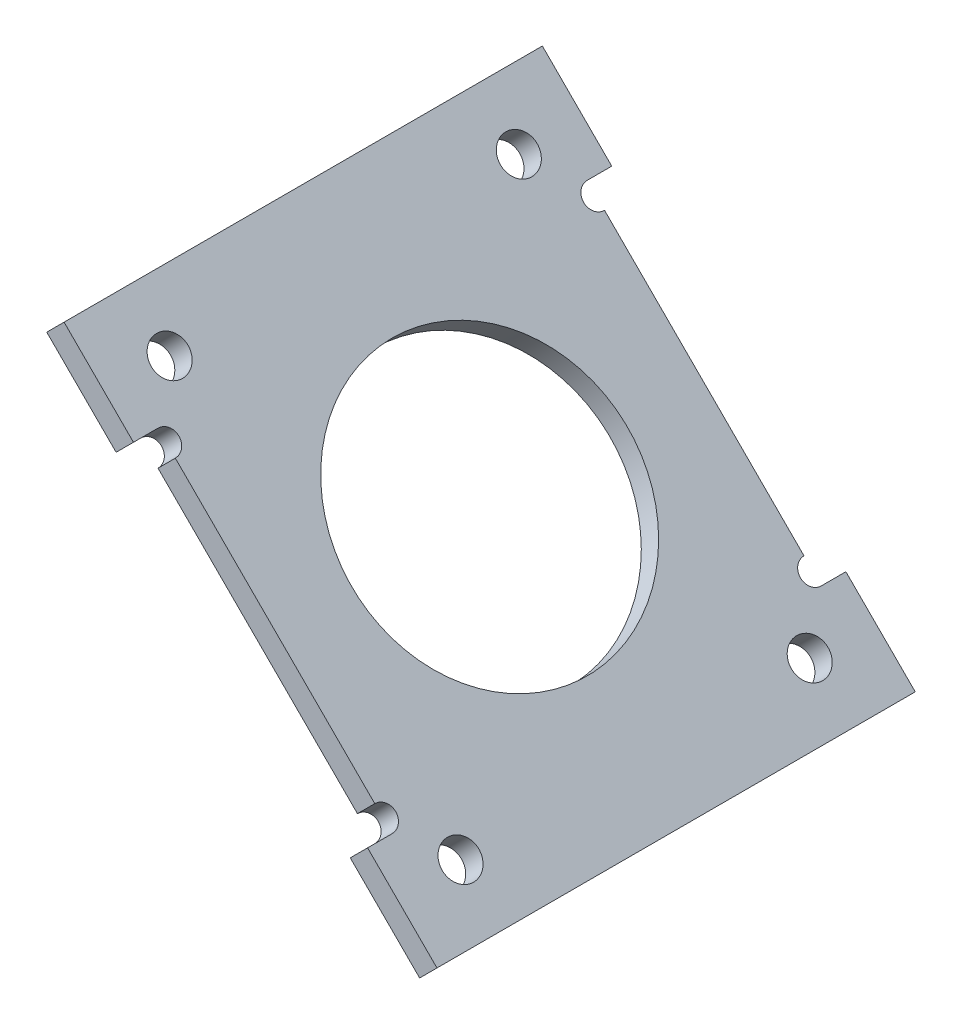
ISO-10303-21;
HEADER;
FILE_DESCRIPTION(('STEP AP214'),'2;1');
FILE_NAME('part.step','',(''),(''),'','','');
FILE_SCHEMA(('AUTOMOTIVE_DESIGN { 1 0 10303 214 1 1 1 1 }'));
ENDSEC;
DATA;
#1=APPLICATION_CONTEXT('core data for automotive mechanical design processes');
#2=APPLICATION_PROTOCOL_DEFINITION('international standard','automotive_design',2000,#1);
#3=PRODUCT_CONTEXT('',#1,'mechanical');
#4=PRODUCT('Part','Part','',(#3));
#5=PRODUCT_RELATED_PRODUCT_CATEGORY('part','',(#4));
#6=PRODUCT_DEFINITION_FORMATION('','',#4);
#7=PRODUCT_DEFINITION_CONTEXT('part definition',#1,'design');
#8=PRODUCT_DEFINITION('design','',#6,#7);
#9=PRODUCT_DEFINITION_SHAPE('','',#8);
#10=(LENGTH_UNIT() NAMED_UNIT(*) SI_UNIT(.MILLI.,.METRE.));
#11=(NAMED_UNIT(*) PLANE_ANGLE_UNIT() SI_UNIT($,.RADIAN.));
#12=(NAMED_UNIT(*) SI_UNIT($,.STERADIAN.) SOLID_ANGLE_UNIT());
#13=UNCERTAINTY_MEASURE_WITH_UNIT(LENGTH_MEASURE(1.E-05),#10,'distance_accuracy_value','');
#14=(GEOMETRIC_REPRESENTATION_CONTEXT(3) GLOBAL_UNCERTAINTY_ASSIGNED_CONTEXT((#13)) GLOBAL_UNIT_ASSIGNED_CONTEXT((#10,
#11,#12)) REPRESENTATION_CONTEXT('',''));
#15=CARTESIAN_POINT('',(0.,0.,0.));
#16=DIRECTION('',(0.,0.,1.));
#17=DIRECTION('',(1.,0.,0.));
#18=AXIS2_PLACEMENT_3D('',#15,#16,#17);
#19=CARTESIAN_POINT('',(-2219.38980011112,1830.14383467254,-536.865419528117));
#20=DIRECTION('',(0.707106781186547,0.707106781186548,0.));
#21=DIRECTION('',(-0.707106781186548,0.707106781186547,0.));
#22=AXIS2_PLACEMENT_3D('',#19,#20,#21);
#23=PLANE('',#22);
#24=CARTESIAN_POINT('',(-2911.78706845621,2522.54110301763,-15.4999999998148));
#25=DIRECTION('',(0.707106781186547,0.707106781186548,0.));
#26=DIRECTION('',(-0.707106781186548,0.707106781186547,0.));
#27=AXIS2_PLACEMENT_3D('',#24,#25,#26);
#28=CIRCLE('',#27,11.25);
#29=CARTESIAN_POINT('',(-2919.74201974456,2530.49605430598,-15.4999999998148));
#30=VERTEX_POINT('',#29);
#31=EDGE_CURVE('E225',#30,#30,#28,.F.);
#32=ORIENTED_EDGE('',*,*,#31,.T.);
#33=EDGE_LOOP('',(#32));
#34=FACE_BOUND('',#33,.T.);
#35=CARTESIAN_POINT('',(-2899.92726215357,2510.68129671499,-29.7369098394943));
#36=DIRECTION('',(0.707106781186547,0.707106781186548,0.));
#37=DIRECTION('',(-0.707106781186548,0.707106781186547,0.));
#38=AXIS2_PLACEMENT_3D('',#35,#36,#37);
#39=CIRCLE('',#38,1.50000000000006);
#40=CARTESIAN_POINT('',(-2900.98792232535,2511.74195688677,-29.7369098394943));
#41=VERTEX_POINT('',#40);
#42=EDGE_CURVE('E228',#41,#41,#39,.F.);
#43=ORIENTED_EDGE('',*,*,#42,.T.);
#44=EDGE_LOOP('',(#43));
#45=FACE_BOUND('',#44,.T.);
#46=CARTESIAN_POINT('',(-2899.92729799251,2510.68133255394,-1.26303045044951));
#47=DIRECTION('',(0.707106781186547,0.707106781186548,0.));
#48=DIRECTION('',(-0.707106781186548,0.707106781186547,0.));
#49=AXIS2_PLACEMENT_3D('',#46,#47,#48);
#50=CIRCLE('',#49,1.50000000000006);
#51=CARTESIAN_POINT('',(-2900.98795816429,2511.74199272572,-1.26303045044951));
#52=VERTEX_POINT('',#51);
#53=EDGE_CURVE('E231',#52,#52,#50,.F.);
#54=ORIENTED_EDGE('',*,*,#53,.T.);
#55=EDGE_LOOP('',(#54));
#56=FACE_BOUND('',#55,.T.);
#57=CARTESIAN_POINT('',(-2923.64689108056,2534.40092564199,-1.26309016027195));
#58=DIRECTION('',(0.707106781186547,0.707106781186548,0.));
#59=DIRECTION('',(-0.707106781186548,0.707106781186547,0.));
#60=AXIS2_PLACEMENT_3D('',#57,#58,#59);
#61=CIRCLE('',#60,1.50000000000006);
#62=CARTESIAN_POINT('',(-2924.70755125234,2535.46158581377,-1.26309016027195));
#63=VERTEX_POINT('',#62);
#64=EDGE_CURVE('E234',#63,#63,#61,.F.);
#65=ORIENTED_EDGE('',*,*,#64,.T.);
#66=EDGE_LOOP('',(#65));
#67=FACE_BOUND('',#66,.T.);
#68=CARTESIAN_POINT('',(-2923.64689108056,2534.40092564199,-29.7369098393574));
#69=DIRECTION('',(-0.707106781186547,-0.707106781186548,0.));
#70=DIRECTION('',(0.707106781186548,-0.707106781186547,0.));
#71=AXIS2_PLACEMENT_3D('',#68,#69,#70);
#72=CIRCLE('',#71,1.50000000000006);
#73=CARTESIAN_POINT('',(-2922.58623090878,2533.34026547021,-29.7369098393574));
#74=VERTEX_POINT('',#73);
#75=EDGE_CURVE('E237',#74,#74,#72,.T.);
#76=ORIENTED_EDGE('',*,*,#75,.T.);
#77=EDGE_LOOP('',(#76));
#78=FACE_BOUND('',#77,.T.);
#79=CARTESIAN_POINT('',(-2902.94823369138,2513.7022682528,-32.9999999998147));
#80=DIRECTION('',(0.707106781186547,0.707106781186548,0.));
#81=DIRECTION('',(-0.707106781186548,0.707106781186547,0.));
#82=AXIS2_PLACEMENT_3D('',#79,#80,#81);
#83=CIRCLE('',#82,0.999999999999943);
#84=CARTESIAN_POINT('',(-2902.24112691019,2512.99516147161,-32.9999999998147));
#85=VERTEX_POINT('',#84);
#86=CARTESIAN_POINT('',(-2903.65534047256,2514.40937503399,-32.9999999998147));
#87=VERTEX_POINT('',#86);
#88=EDGE_CURVE('E151',#85,#87,#83,.F.);
#89=ORIENTED_EDGE('',*,*,#88,.T.);
#90=DIRECTION('',(0.707106781186548,-0.707106781186548,0.));
#91=VECTOR('',#90,1.);
#92=CARTESIAN_POINT('',(-2919.91879643985,2530.67283100128,-32.9999999998147));
#93=LINE('',#92,#91);
#94=CARTESIAN_POINT('',(-2919.91879643985,2530.67283100128,-32.9999999998147));
#95=VERTEX_POINT('',#94);
#96=EDGE_CURVE('E148',#95,#87,#93,.T.);
#97=ORIENTED_EDGE('',*,*,#96,.F.);
#98=CARTESIAN_POINT('',(-2920.62590322104,2531.37993778247,-32.9999999998147));
#99=DIRECTION('',(0.707106781186547,0.707106781186548,0.));
#100=DIRECTION('',(-0.707106781186548,0.707106781186547,0.));
#101=AXIS2_PLACEMENT_3D('',#98,#99,#100);
#102=CIRCLE('',#101,0.999999999999943);
#103=CARTESIAN_POINT('',(-2921.33301000222,2532.08704456365,-32.9999999998147));
#104=VERTEX_POINT('',#103);
#105=EDGE_CURVE('E130',#95,#104,#102,.F.);
#106=ORIENTED_EDGE('',*,*,#105,.T.);
#107=DIRECTION('',(0.,0.,1.));
#108=VECTOR('',#107,1.);
#109=CARTESIAN_POINT('',(-2921.33301000222,2532.08704456366,-32.9999999998147));
#110=LINE('',#109,#108);
#111=CARTESIAN_POINT('',(-2921.33301000222,2532.08704456365,-34.9999999998147));
#112=VERTEX_POINT('',#111);
#113=EDGE_CURVE('E126',#112,#104,#110,.T.);
#114=ORIENTED_EDGE('',*,*,#113,.F.);
#115=DIRECTION('',(0.707106781187214,-0.707106781185881,0.));
#116=VECTOR('',#115,1.);
#117=CARTESIAN_POINT('',(-2926.98986425172,2537.74389881314,-34.9999999998147));
#118=LINE('',#117,#116);
#119=CARTESIAN_POINT('',(-2926.98986425172,2537.74389881314,-34.9999999998147));
#120=VERTEX_POINT('',#119);
#121=EDGE_CURVE('E118',#120,#112,#118,.T.);
#122=ORIENTED_EDGE('',*,*,#121,.F.);
#123=DIRECTION('',(0.,0.,1.));
#124=VECTOR('',#123,1.);
#125=CARTESIAN_POINT('',(-2926.98986425172,2537.74389881314,-34.9999999998147));
#126=LINE('',#125,#124);
#127=CARTESIAN_POINT('',(-2926.98986425172,2537.74389881314,4.00000000018535));
#128=VERTEX_POINT('',#127);
#129=EDGE_CURVE('E113',#128,#120,#126,.F.);
#130=ORIENTED_EDGE('',*,*,#129,.F.);
#131=DIRECTION('',(-0.707106781187214,0.707106781185881,0.));
#132=VECTOR('',#131,1.);
#133=CARTESIAN_POINT('',(-2921.33301000222,2532.08704456365,4.00000000018535));
#134=LINE('',#133,#132);
#135=CARTESIAN_POINT('',(-2921.33301000222,2532.08704456366,4.00000000018535));
#136=VERTEX_POINT('',#135);
#137=EDGE_CURVE('E190',#136,#128,#134,.T.);
#138=ORIENTED_EDGE('',*,*,#137,.F.);
#139=DIRECTION('',(0.,0.,1.));
#140=VECTOR('',#139,1.);
#141=CARTESIAN_POINT('',(-2921.33301000222,2532.08704456366,4.00000000018535));
#142=LINE('',#141,#140);
#143=CARTESIAN_POINT('',(-2921.33301000222,2532.08704456365,2.00000000018532));
#144=VERTEX_POINT('',#143);
#145=EDGE_CURVE('E90',#144,#136,#142,.T.);
#146=ORIENTED_EDGE('',*,*,#145,.F.);
#147=CARTESIAN_POINT('',(-2920.62590322104,2531.37993778247,2.00000000018532));
#148=DIRECTION('',(0.707106781186547,0.707106781186548,0.));
#149=DIRECTION('',(-0.707106781186548,0.707106781186547,0.));
#150=AXIS2_PLACEMENT_3D('',#147,#148,#149);
#151=CIRCLE('',#150,0.999999999999943);
#152=CARTESIAN_POINT('',(-2919.91879643985,2530.67283100128,2.00000000018532));
#153=VERTEX_POINT('',#152);
#154=EDGE_CURVE('E19',#144,#153,#151,.F.);
#155=ORIENTED_EDGE('',*,*,#154,.T.);
#156=DIRECTION('',(-0.707106781186548,0.707106781186548,0.));
#157=VECTOR('',#156,1.);
#158=CARTESIAN_POINT('',(-2903.65534047256,2514.40937503399,2.00000000018531));
#159=LINE('',#158,#157);
#160=CARTESIAN_POINT('',(-2903.65534047256,2514.40937503399,2.00000000018532));
#161=VERTEX_POINT('',#160);
#162=EDGE_CURVE('E182',#161,#153,#159,.T.);
#163=ORIENTED_EDGE('',*,*,#162,.F.);
#164=CARTESIAN_POINT('',(-2902.94823369138,2513.7022682528,2.00000000018532));
#165=DIRECTION('',(0.707106781186547,0.707106781186548,0.));
#166=DIRECTION('',(-0.707106781186548,0.707106781186547,0.));
#167=AXIS2_PLACEMENT_3D('',#164,#165,#166);
#168=CIRCLE('',#167,0.999999999999943);
#169=CARTESIAN_POINT('',(-2902.24112691019,2512.99516147161,2.00000000018532));
#170=VERTEX_POINT('',#169);
#171=EDGE_CURVE('E179',#161,#170,#168,.F.);
#172=ORIENTED_EDGE('',*,*,#171,.T.);
#173=DIRECTION('',(0.,0.,1.));
#174=VECTOR('',#173,1.);
#175=CARTESIAN_POINT('',(-2902.24112691019,2512.99516147161,2.00000000018532));
#176=LINE('',#175,#174);
#177=CARTESIAN_POINT('',(-2902.24112691019,2512.99516147161,4.00000000018535));
#178=VERTEX_POINT('',#177);
#179=EDGE_CURVE('E177',#178,#170,#176,.F.);
#180=ORIENTED_EDGE('',*,*,#179,.F.);
#181=DIRECTION('',(-0.707106781186548,0.707106781186548,0.));
#182=VECTOR('',#181,1.);
#183=CARTESIAN_POINT('',(-2896.5842726607,2507.33830722212,4.00000000018535));
#184=LINE('',#183,#182);
#185=CARTESIAN_POINT('',(-2896.5842726607,2507.33830722212,4.00000000018535));
#186=VERTEX_POINT('',#185);
#187=EDGE_CURVE('E171',#186,#178,#184,.T.);
#188=ORIENTED_EDGE('',*,*,#187,.F.);
#189=DIRECTION('',(0.,0.,1.));
#190=VECTOR('',#189,1.);
#191=CARTESIAN_POINT('',(-2896.5842726607,2507.33830722212,4.00000000018535));
#192=LINE('',#191,#190);
#193=CARTESIAN_POINT('',(-2896.5842726607,2507.33830722212,-34.9999999998147));
#194=VERTEX_POINT('',#193);
#195=EDGE_CURVE('E165',#194,#186,#192,.T.);
#196=ORIENTED_EDGE('',*,*,#195,.F.);
#197=DIRECTION('',(0.707106781186548,-0.707106781186548,0.));
#198=VECTOR('',#197,1.);
#199=CARTESIAN_POINT('',(-2902.24112691019,2512.99516147161,-34.9999999998147));
#200=LINE('',#199,#198);
#201=CARTESIAN_POINT('',(-2902.24112691019,2512.99516147161,-34.9999999998147));
#202=VERTEX_POINT('',#201);
#203=EDGE_CURVE('E159',#202,#194,#200,.T.);
#204=ORIENTED_EDGE('',*,*,#203,.F.);
#205=DIRECTION('',(0.,0.,1.));
#206=VECTOR('',#205,1.);
#207=CARTESIAN_POINT('',(-2902.24112691019,2512.99516147161,-34.9999999998147));
#208=LINE('',#207,#206);
#209=EDGE_CURVE('E152',#85,#202,#208,.F.);
#210=ORIENTED_EDGE('',*,*,#209,.F.);
#211=EDGE_LOOP('',(#89,#97,#106,#114,#122,#130,#138,#146,#155,#163,#172,#180,#188,#196,#204,#210));
#212=FACE_BOUND('',#211,.T.);
#213=ADVANCED_FACE('F16',(#34,#45,#56,#67,#78,#212),#23,.T.);
#214=CARTESIAN_POINT('',(-2922.7472235646,2530.67283100128,-32.9999999998147));
#215=DIRECTION('',(0.707106781186548,-0.707106781186547,0.));
#216=DIRECTION('',(0.707106781186547,0.707106781186548,0.));
#217=AXIS2_PLACEMENT_3D('',#214,#215,#216);
#218=PLANE('',#217);
#219=ORIENTED_EDGE('',*,*,#113,.T.);
#220=DIRECTION('',(0.707106781186547,0.707106781186548,0.));
#221=VECTOR('',#220,1.);
#222=CARTESIAN_POINT('',(-2922.7472235646,2530.67283100128,-32.9999999998147));
#223=LINE('',#222,#221);
#224=CARTESIAN_POINT('',(-2922.7472235646,2530.67283100128,-32.9999999998147));
#225=VERTEX_POINT('',#224);
#226=EDGE_CURVE('E240',#104,#225,#223,.F.);
#227=ORIENTED_EDGE('',*,*,#226,.T.);
#228=DIRECTION('',(0.,0.,1.));
#229=VECTOR('',#228,1.);
#230=CARTESIAN_POINT('',(-2922.7472235646,2530.67283100128,-536.865419528117));
#231=LINE('',#230,#229);
#232=CARTESIAN_POINT('',(-2922.7472235646,2530.67283100128,-34.9999999998147));
#233=VERTEX_POINT('',#232);
#234=EDGE_CURVE('E137',#225,#233,#231,.F.);
#235=ORIENTED_EDGE('',*,*,#234,.T.);
#236=DIRECTION('',(-0.707106781188879,-0.707106781184216,0.));
#237=VECTOR('',#236,1.);
#238=CARTESIAN_POINT('',(-2921.33301000222,2532.08704456365,-34.9999999998147));
#239=LINE('',#238,#237);
#240=EDGE_CURVE('E123',#112,#233,#239,.T.);
#241=ORIENTED_EDGE('',*,*,#240,.F.);
#242=EDGE_LOOP('',(#219,#227,#235,#241));
#243=FACE_BOUND('',#242,.T.);
#244=ADVANCED_FACE('F136',(#243),#218,.T.);
#245=CARTESIAN_POINT('',(-2922.7472235646,2530.67283100128,-34.9999999998147));
#246=DIRECTION('',(0.,0.,-1.));
#247=DIRECTION('',(-1.,0.,0.));
#248=AXIS2_PLACEMENT_3D('',#245,#246,#247);
#249=PLANE('',#248);
#250=ORIENTED_EDGE('',*,*,#121,.T.);
#251=ORIENTED_EDGE('',*,*,#240,.T.);
#252=DIRECTION('',(-0.707106781186548,0.707106781186547,0.));
#253=VECTOR('',#252,1.);
#254=CARTESIAN_POINT('',(-2220.80401367349,1828.72962111017,-34.9999999998147));
#255=LINE('',#254,#253);
#256=CARTESIAN_POINT('',(-2928.40407781409,2536.32968525077,-34.9999999998147));
#257=VERTEX_POINT('',#256);
#258=EDGE_CURVE('E273',#233,#257,#255,.T.);
#259=ORIENTED_EDGE('',*,*,#258,.T.);
#260=DIRECTION('',(-0.707106781186547,-0.707106781186548,0.));
#261=VECTOR('',#260,1.);
#262=CARTESIAN_POINT('',(-2928.40407781409,2536.32968525077,-34.9999999998147));
#263=LINE('',#262,#261);
#264=EDGE_CURVE('E125',#120,#257,#263,.T.);
#265=ORIENTED_EDGE('',*,*,#264,.F.);
#266=EDGE_LOOP('',(#250,#251,#259,#265));
#267=FACE_BOUND('',#266,.T.);
#268=ADVANCED_FACE('F120',(#267),#249,.T.);
#269=CARTESIAN_POINT('',(-2928.40407781409,2536.32968525077,-34.9999999998147));
#270=DIRECTION('',(-0.707106781186548,0.707106781186547,0.));
#271=DIRECTION('',(-0.707106781186547,-0.707106781186548,0.));
#272=AXIS2_PLACEMENT_3D('',#269,#270,#271);
#273=PLANE('',#272);
#274=ORIENTED_EDGE('',*,*,#129,.T.);
#275=ORIENTED_EDGE('',*,*,#264,.T.);
#276=DIRECTION('',(0.,0.,1.));
#277=VECTOR('',#276,1.);
#278=CARTESIAN_POINT('',(-2928.40407781409,2536.32968525077,-536.865419528117));
#279=LINE('',#278,#277);
#280=CARTESIAN_POINT('',(-2928.40407781409,2536.32968525077,4.00000000018532));
#281=VERTEX_POINT('',#280);
#282=EDGE_CURVE('E264',#257,#281,#279,.T.);
#283=ORIENTED_EDGE('',*,*,#282,.T.);
#284=DIRECTION('',(-0.707106781186658,-0.707106781186436,0.));
#285=VECTOR('',#284,1.);
#286=CARTESIAN_POINT('',(-2926.98986425172,2537.74389881314,4.00000000018535));
#287=LINE('',#286,#285);
#288=EDGE_CURVE('E187',#128,#281,#287,.T.);
#289=ORIENTED_EDGE('',*,*,#288,.F.);
#290=EDGE_LOOP('',(#274,#275,#283,#289));
#291=FACE_BOUND('',#290,.T.);
#292=ADVANCED_FACE('F354',(#291),#273,.T.);
#293=CARTESIAN_POINT('',(-2928.40407781409,2536.32968525077,4.00000000018535));
#294=DIRECTION('',(0.,0.,1.));
#295=DIRECTION('',(1.,0.,0.));
#296=AXIS2_PLACEMENT_3D('',#293,#294,#295);
#297=PLANE('',#296);
#298=ORIENTED_EDGE('',*,*,#137,.T.);
#299=ORIENTED_EDGE('',*,*,#288,.T.);
#300=DIRECTION('',(-0.707106781186548,0.707106781186547,0.));
#301=VECTOR('',#300,1.);
#302=CARTESIAN_POINT('',(-2220.80401367349,1828.72962111017,4.0000000001853));
#303=LINE('',#302,#301);
#304=CARTESIAN_POINT('',(-2922.7472235646,2530.67283100128,4.00000000018532));
#305=VERTEX_POINT('',#304);
#306=EDGE_CURVE('E261',#281,#305,#303,.F.);
#307=ORIENTED_EDGE('',*,*,#306,.T.);
#308=DIRECTION('',(0.707106781186547,0.707106781186548,0.));
#309=VECTOR('',#308,1.);
#310=CARTESIAN_POINT('',(-2922.7472235646,2530.67283100128,4.00000000018535));
#311=LINE('',#310,#309);
#312=EDGE_CURVE('E186',#136,#305,#311,.F.);
#313=ORIENTED_EDGE('',*,*,#312,.F.);
#314=EDGE_LOOP('',(#298,#299,#307,#313));
#315=FACE_BOUND('',#314,.T.);
#316=ADVANCED_FACE('F353',(#315),#297,.T.);
#317=CARTESIAN_POINT('',(-2922.7472235646,2530.67283100128,4.00000000018535));
#318=DIRECTION('',(0.707106781186548,-0.707106781186547,0.));
#319=DIRECTION('',(0.707106781186547,0.707106781186548,0.));
#320=AXIS2_PLACEMENT_3D('',#317,#318,#319);
#321=PLANE('',#320);
#322=ORIENTED_EDGE('',*,*,#145,.T.);
#323=ORIENTED_EDGE('',*,*,#312,.T.);
#324=DIRECTION('',(0.,0.,1.));
#325=VECTOR('',#324,1.);
#326=CARTESIAN_POINT('',(-2922.7472235646,2530.67283100128,-536.865419528117));
#327=LINE('',#326,#325);
#328=CARTESIAN_POINT('',(-2922.7472235646,2530.67283100128,2.00000000018532));
#329=VERTEX_POINT('',#328);
#330=EDGE_CURVE('E224',#305,#329,#327,.F.);
#331=ORIENTED_EDGE('',*,*,#330,.T.);
#332=DIRECTION('',(0.707106781186547,0.707106781186548,0.));
#333=VECTOR('',#332,1.);
#334=CARTESIAN_POINT('',(-2922.7472235646,2530.67283100128,2.00000000018532));
#335=LINE('',#334,#333);
#336=EDGE_CURVE('E256',#329,#144,#335,.T.);
#337=ORIENTED_EDGE('',*,*,#336,.T.);
#338=EDGE_LOOP('',(#322,#323,#331,#337));
#339=FACE_BOUND('',#338,.T.);
#340=ADVANCED_FACE('F346',(#339),#321,.T.);
#341=CARTESIAN_POINT('',(-2922.04011678341,2529.96572422009,2.00000000018532));
#342=DIRECTION('',(0.707106781186547,0.707106781186548,0.));
#343=DIRECTION('',(-0.707106781186548,0.707106781186547,0.));
#344=AXIS2_PLACEMENT_3D('',#341,#342,#343);
#345=CYLINDRICAL_SURFACE('',#344,0.999999999999943);
#346=DIRECTION('',(-0.707106781184105,-0.70710678118899,0.));
#347=VECTOR('',#346,1.);
#348=CARTESIAN_POINT('',(-2919.91879643985,2530.67283100128,2.00000000018532));
#349=LINE('',#348,#347);
#350=CARTESIAN_POINT('',(-2921.33301000222,2529.2586174389,2.0000000001853));
#351=VERTEX_POINT('',#350);
#352=EDGE_CURVE('E184',#153,#351,#349,.T.);
#353=ORIENTED_EDGE('',*,*,#352,.F.);
#354=ORIENTED_EDGE('',*,*,#154,.F.);
#355=ORIENTED_EDGE('',*,*,#336,.F.);
#356=CARTESIAN_POINT('',(-2922.04011678341,2529.96572422009,2.00000000018532));
#357=DIRECTION('',(0.707106781186547,0.707106781186548,0.));
#358=DIRECTION('',(-0.707106781186548,0.707106781186547,0.));
#359=AXIS2_PLACEMENT_3D('',#356,#357,#358);
#360=CIRCLE('',#359,0.999999999999943);
#361=EDGE_CURVE('E221',#329,#351,#360,.F.);
#362=ORIENTED_EDGE('',*,*,#361,.T.);
#363=EDGE_LOOP('',(#353,#354,#355,#362));
#364=FACE_BOUND('',#363,.T.);
#365=ADVANCED_FACE('F433',(#364),#345,.F.);
#366=CARTESIAN_POINT('',(-2921.33301000222,2529.2586174389,2.00000000018532));
#367=DIRECTION('',(0.,0.,1.));
#368=DIRECTION('',(1.,0.,0.));
#369=AXIS2_PLACEMENT_3D('',#366,#367,#368);
#370=PLANE('',#369);
#371=ORIENTED_EDGE('',*,*,#162,.T.);
#372=ORIENTED_EDGE('',*,*,#352,.T.);
#373=DIRECTION('',(-0.707106781186548,0.707106781186547,0.));
#374=VECTOR('',#373,1.);
#375=CARTESIAN_POINT('',(-2220.80401367349,1828.72962111017,2.0000000001853));
#376=LINE('',#375,#374);
#377=CARTESIAN_POINT('',(-2905.06955403494,2512.99516147162,2.0000000001853));
#378=VERTEX_POINT('',#377);
#379=EDGE_CURVE('E220',#351,#378,#376,.F.);
#380=ORIENTED_EDGE('',*,*,#379,.T.);
#381=DIRECTION('',(0.707106781186547,0.707106781186548,0.));
#382=VECTOR('',#381,1.);
#383=CARTESIAN_POINT('',(-2905.06955403494,2512.99516147162,2.00000000018532));
#384=LINE('',#383,#382);
#385=EDGE_CURVE('E244',#378,#161,#384,.T.);
#386=ORIENTED_EDGE('',*,*,#385,.T.);
#387=EDGE_LOOP('',(#371,#372,#380,#386));
#388=FACE_BOUND('',#387,.T.);
#389=ADVANCED_FACE('F436',(#388),#370,.T.);
#390=CARTESIAN_POINT('',(-2904.36244725375,2512.28805469043,2.00000000018532));
#391=DIRECTION('',(0.707106781186547,0.707106781186548,0.));
#392=DIRECTION('',(-0.707106781186548,0.707106781186547,0.));
#393=AXIS2_PLACEMENT_3D('',#390,#391,#392);
#394=CYLINDRICAL_SURFACE('',#393,0.999999999999943);
#395=DIRECTION('',(-0.707106781186547,-0.707106781186548,0.));
#396=VECTOR('',#395,1.);
#397=CARTESIAN_POINT('',(-2903.65534047256,2511.58094790924,2.00000000018532));
#398=LINE('',#397,#396);
#399=CARTESIAN_POINT('',(-2903.65534047256,2511.58094790924,2.00000000018531));
#400=VERTEX_POINT('',#399);
#401=EDGE_CURVE('E174',#170,#400,#398,.T.);
#402=ORIENTED_EDGE('',*,*,#401,.F.);
#403=ORIENTED_EDGE('',*,*,#171,.F.);
#404=ORIENTED_EDGE('',*,*,#385,.F.);
#405=CARTESIAN_POINT('',(-2904.36244725375,2512.28805469043,2.00000000018532));
#406=DIRECTION('',(0.707106781186547,0.707106781186548,0.));
#407=DIRECTION('',(-0.707106781186548,0.707106781186547,0.));
#408=AXIS2_PLACEMENT_3D('',#405,#406,#407);
#409=CIRCLE('',#408,0.999999999999943);
#410=EDGE_CURVE('E216',#378,#400,#409,.F.);
#411=ORIENTED_EDGE('',*,*,#410,.T.);
#412=EDGE_LOOP('',(#402,#403,#404,#411));
#413=FACE_BOUND('',#412,.T.);
#414=ADVANCED_FACE('F440',(#413),#394,.F.);
#415=CARTESIAN_POINT('',(-2903.65534047256,2511.58094790924,2.00000000018532));
#416=DIRECTION('',(-0.707106781186548,0.707106781186547,0.));
#417=DIRECTION('',(-0.707106781186547,-0.707106781186548,0.));
#418=AXIS2_PLACEMENT_3D('',#415,#416,#417);
#419=PLANE('',#418);
#420=ORIENTED_EDGE('',*,*,#179,.T.);
#421=ORIENTED_EDGE('',*,*,#401,.T.);
#422=DIRECTION('',(0.,0.,1.));
#423=VECTOR('',#422,1.);
#424=CARTESIAN_POINT('',(-2903.65534047256,2511.58094790924,-536.865419528117));
#425=LINE('',#424,#423);
#426=CARTESIAN_POINT('',(-2903.65534047256,2511.58094790924,4.00000000018532));
#427=VERTEX_POINT('',#426);
#428=EDGE_CURVE('E219',#400,#427,#425,.T.);
#429=ORIENTED_EDGE('',*,*,#428,.T.);
#430=DIRECTION('',(-0.707106781186547,-0.707106781186547,0.));
#431=VECTOR('',#430,1.);
#432=CARTESIAN_POINT('',(-2902.24112691019,2512.99516147161,4.00000000018535));
#433=LINE('',#432,#431);
#434=EDGE_CURVE('E168',#178,#427,#433,.T.);
#435=ORIENTED_EDGE('',*,*,#434,.F.);
#436=EDGE_LOOP('',(#420,#421,#429,#435));
#437=FACE_BOUND('',#436,.T.);
#438=ADVANCED_FACE('F336',(#437),#419,.T.);
#439=CARTESIAN_POINT('',(-2903.65534047256,2511.58094790924,4.00000000018535));
#440=DIRECTION('',(0.,0.,1.));
#441=DIRECTION('',(1.,0.,0.));
#442=AXIS2_PLACEMENT_3D('',#439,#440,#441);
#443=PLANE('',#442);
#444=ORIENTED_EDGE('',*,*,#187,.T.);
#445=ORIENTED_EDGE('',*,*,#434,.T.);
#446=DIRECTION('',(-0.707106781186548,0.707106781186547,0.));
#447=VECTOR('',#446,1.);
#448=CARTESIAN_POINT('',(-2220.80401367349,1828.72962111017,4.0000000001853));
#449=LINE('',#448,#447);
#450=CARTESIAN_POINT('',(-2897.99848622307,2505.92409365975,4.00000000018532));
#451=VERTEX_POINT('',#450);
#452=EDGE_CURVE('E306',#427,#451,#449,.F.);
#453=ORIENTED_EDGE('',*,*,#452,.T.);
#454=DIRECTION('',(0.707106781186547,0.707106781186548,0.));
#455=VECTOR('',#454,1.);
#456=CARTESIAN_POINT('',(-2897.99848622307,2505.92409365975,4.00000000018535));
#457=LINE('',#456,#455);
#458=EDGE_CURVE('E162',#186,#451,#457,.F.);
#459=ORIENTED_EDGE('',*,*,#458,.F.);
#460=EDGE_LOOP('',(#444,#445,#453,#459));
#461=FACE_BOUND('',#460,.T.);
#462=ADVANCED_FACE('F322',(#461),#443,.T.);
#463=CARTESIAN_POINT('',(-2897.99848622307,2505.92409365975,4.00000000018535));
#464=DIRECTION('',(0.707106781186548,-0.707106781186547,0.));
#465=DIRECTION('',(0.707106781186547,0.707106781186548,0.));
#466=AXIS2_PLACEMENT_3D('',#463,#464,#465);
#467=PLANE('',#466);
#468=ORIENTED_EDGE('',*,*,#195,.T.);
#469=ORIENTED_EDGE('',*,*,#458,.T.);
#470=DIRECTION('',(0.,0.,1.));
#471=VECTOR('',#470,1.);
#472=CARTESIAN_POINT('',(-2897.99848622307,2505.92409365975,-536.865419528117));
#473=LINE('',#472,#471);
#474=CARTESIAN_POINT('',(-2897.99848622307,2505.92409365975,-34.9999999998147));
#475=VERTEX_POINT('',#474);
#476=EDGE_CURVE('E297',#451,#475,#473,.F.);
#477=ORIENTED_EDGE('',*,*,#476,.T.);
#478=DIRECTION('',(-0.707106781186547,-0.707106781186547,0.));
#479=VECTOR('',#478,1.);
#480=CARTESIAN_POINT('',(-2896.5842726607,2507.33830722212,-34.9999999998147));
#481=LINE('',#480,#479);
#482=EDGE_CURVE('E156',#194,#475,#481,.T.);
#483=ORIENTED_EDGE('',*,*,#482,.F.);
#484=EDGE_LOOP('',(#468,#469,#477,#483));
#485=FACE_BOUND('',#484,.T.);
#486=ADVANCED_FACE('F448',(#485),#467,.T.);
#487=CARTESIAN_POINT('',(-2897.99848622307,2505.92409365975,-34.9999999998147));
#488=DIRECTION('',(0.,0.,-1.));
#489=DIRECTION('',(-1.,0.,0.));
#490=AXIS2_PLACEMENT_3D('',#487,#488,#489);
#491=PLANE('',#490);
#492=ORIENTED_EDGE('',*,*,#203,.T.);
#493=ORIENTED_EDGE('',*,*,#482,.T.);
#494=DIRECTION('',(-0.707106781186548,0.707106781186547,0.));
#495=VECTOR('',#494,1.);
#496=CARTESIAN_POINT('',(-2220.80401367349,1828.72962111017,-34.9999999998147));
#497=LINE('',#496,#495);
#498=CARTESIAN_POINT('',(-2903.65534047256,2511.58094790924,-34.9999999998147));
#499=VERTEX_POINT('',#498);
#500=EDGE_CURVE('E294',#475,#499,#497,.T.);
#501=ORIENTED_EDGE('',*,*,#500,.T.);
#502=DIRECTION('',(-0.707106781186547,-0.707106781186548,0.));
#503=VECTOR('',#502,1.);
#504=CARTESIAN_POINT('',(-2903.65534047256,2511.58094790924,-34.9999999998147));
#505=LINE('',#504,#503);
#506=EDGE_CURVE('E155',#202,#499,#505,.T.);
#507=ORIENTED_EDGE('',*,*,#506,.F.);
#508=EDGE_LOOP('',(#492,#493,#501,#507));
#509=FACE_BOUND('',#508,.T.);
#510=ADVANCED_FACE('F451',(#509),#491,.T.);
#511=CARTESIAN_POINT('',(-2903.65534047256,2511.58094790924,-34.9999999998147));
#512=DIRECTION('',(-0.707106781186548,0.707106781186547,0.));
#513=DIRECTION('',(-0.707106781186547,-0.707106781186548,0.));
#514=AXIS2_PLACEMENT_3D('',#511,#512,#513);
#515=PLANE('',#514);
#516=ORIENTED_EDGE('',*,*,#209,.T.);
#517=ORIENTED_EDGE('',*,*,#506,.T.);
#518=DIRECTION('',(0.,0.,1.));
#519=VECTOR('',#518,1.);
#520=CARTESIAN_POINT('',(-2903.65534047256,2511.58094790924,-536.865419528117));
#521=LINE('',#520,#519);
#522=CARTESIAN_POINT('',(-2903.65534047256,2511.58094790924,-32.9999999998147));
#523=VERTEX_POINT('',#522);
#524=EDGE_CURVE('E215',#499,#523,#521,.T.);
#525=ORIENTED_EDGE('',*,*,#524,.T.);
#526=DIRECTION('',(0.707106781186547,0.707106781186548,0.));
#527=VECTOR('',#526,1.);
#528=CARTESIAN_POINT('',(-2903.65534047256,2511.58094790924,-32.9999999998147));
#529=LINE('',#528,#527);
#530=EDGE_CURVE('E242',#523,#85,#529,.T.);
#531=ORIENTED_EDGE('',*,*,#530,.T.);
#532=EDGE_LOOP('',(#516,#517,#525,#531));
#533=FACE_BOUND('',#532,.T.);
#534=ADVANCED_FACE('F455',(#533),#515,.T.);
#535=CARTESIAN_POINT('',(-2904.36244725375,2512.28805469043,-32.9999999998147));
#536=DIRECTION('',(0.707106781186547,0.707106781186548,0.));
#537=DIRECTION('',(-0.707106781186548,0.707106781186547,0.));
#538=AXIS2_PLACEMENT_3D('',#535,#536,#537);
#539=CYLINDRICAL_SURFACE('',#538,0.999999999999943);
#540=DIRECTION('',(-0.707106781184105,-0.70710678118899,0.));
#541=VECTOR('',#540,1.);
#542=CARTESIAN_POINT('',(-2903.65534047256,2514.40937503399,-32.9999999998147));
#543=LINE('',#542,#541);
#544=CARTESIAN_POINT('',(-2905.06955403493,2512.99516147161,-32.9999999998147));
#545=VERTEX_POINT('',#544);
#546=EDGE_CURVE('E150',#87,#545,#543,.T.);
#547=ORIENTED_EDGE('',*,*,#546,.F.);
#548=ORIENTED_EDGE('',*,*,#88,.F.);
#549=ORIENTED_EDGE('',*,*,#530,.F.);
#550=CARTESIAN_POINT('',(-2904.36244725375,2512.28805469043,-32.9999999998147));
#551=DIRECTION('',(0.707106781186547,0.707106781186548,0.));
#552=DIRECTION('',(-0.707106781186548,0.707106781186547,0.));
#553=AXIS2_PLACEMENT_3D('',#550,#551,#552);
#554=CIRCLE('',#553,0.999999999999943);
#555=EDGE_CURVE('E212',#523,#545,#554,.F.);
#556=ORIENTED_EDGE('',*,*,#555,.T.);
#557=EDGE_LOOP('',(#547,#548,#549,#556));
#558=FACE_BOUND('',#557,.T.);
#559=ADVANCED_FACE('F369',(#558),#539,.F.);
#560=CARTESIAN_POINT('',(-2905.06955403493,2512.99516147161,-32.9999999998147));
#561=DIRECTION('',(0.,0.,-1.));
#562=DIRECTION('',(-1.,0.,0.));
#563=AXIS2_PLACEMENT_3D('',#560,#561,#562);
#564=PLANE('',#563);
#565=ORIENTED_EDGE('',*,*,#96,.T.);
#566=ORIENTED_EDGE('',*,*,#546,.T.);
#567=DIRECTION('',(-0.707106781186548,0.707106781186547,0.));
#568=VECTOR('',#567,1.);
#569=CARTESIAN_POINT('',(-2220.80401367349,1828.72962111017,-32.9999999998147));
#570=LINE('',#569,#568);
#571=CARTESIAN_POINT('',(-2921.33301000222,2529.2586174389,-32.9999999998147));
#572=VERTEX_POINT('',#571);
#573=EDGE_CURVE('E211',#545,#572,#570,.T.);
#574=ORIENTED_EDGE('',*,*,#573,.T.);
#575=DIRECTION('',(0.707106781186547,0.707106781186548,0.));
#576=VECTOR('',#575,1.);
#577=CARTESIAN_POINT('',(-2921.33301000222,2529.2586174389,-32.9999999998147));
#578=LINE('',#577,#576);
#579=EDGE_CURVE('E34',#572,#95,#578,.T.);
#580=ORIENTED_EDGE('',*,*,#579,.T.);
#581=EDGE_LOOP('',(#565,#566,#574,#580));
#582=FACE_BOUND('',#581,.T.);
#583=ADVANCED_FACE('F359',(#582),#564,.T.);
#584=CARTESIAN_POINT('',(-2922.04011678341,2529.96572422009,-32.9999999998147));
#585=DIRECTION('',(0.707106781186547,0.707106781186548,0.));
#586=DIRECTION('',(-0.707106781186548,0.707106781186547,0.));
#587=AXIS2_PLACEMENT_3D('',#584,#585,#586);
#588=CYLINDRICAL_SURFACE('',#587,0.999999999999943);
#589=ORIENTED_EDGE('',*,*,#226,.F.);
#590=ORIENTED_EDGE('',*,*,#105,.F.);
#591=ORIENTED_EDGE('',*,*,#579,.F.);
#592=CARTESIAN_POINT('',(-2922.04011678341,2529.96572422009,-32.9999999998147));
#593=DIRECTION('',(0.707106781186547,0.707106781186548,0.));
#594=DIRECTION('',(-0.707106781186548,0.707106781186547,0.));
#595=AXIS2_PLACEMENT_3D('',#592,#593,#594);
#596=CIRCLE('',#595,0.999999999999943);
#597=EDGE_CURVE('E209',#572,#225,#596,.F.);
#598=ORIENTED_EDGE('',*,*,#597,.T.);
#599=EDGE_LOOP('',(#589,#590,#591,#598));
#600=FACE_BOUND('',#599,.T.);
#601=ADVANCED_FACE('F356',(#600),#588,.F.);
#602=CARTESIAN_POINT('',(-2925.06108027338,2532.98673644917,-29.7369098393574));
#603=DIRECTION('',(-0.707106781186547,-0.707106781186548,0.));
#604=DIRECTION('',(0.707106781186548,-0.707106781186547,0.));
#605=AXIS2_PLACEMENT_3D('',#602,#603,#604);
#606=CYLINDRICAL_SURFACE('',#605,1.50000000000006);
#607=ORIENTED_EDGE('',*,*,#75,.F.);
#608=EDGE_LOOP('',(#607));
#609=FACE_BOUND('',#608,.T.);
#610=CARTESIAN_POINT('',(-2925.06110464294,2532.98671207961,-29.7369098393574));
#611=DIRECTION('',(-0.707106781186547,-0.707106781186548,0.));
#612=DIRECTION('',(0.707106781186548,-0.707106781186547,0.));
#613=AXIS2_PLACEMENT_3D('',#610,#611,#612);
#614=CIRCLE('',#613,1.50000000000006);
#615=CARTESIAN_POINT('',(-2924.00044447116,2531.92605190783,-29.7369098393574));
#616=VERTEX_POINT('',#615);
#617=EDGE_CURVE('E206',#616,#616,#614,.T.);
#618=ORIENTED_EDGE('',*,*,#617,.T.);
#619=EDGE_LOOP('',(#618));
#620=FACE_BOUND('',#619,.T.);
#621=ADVANCED_FACE('F358',(#609,#620),#606,.F.);
#622=CARTESIAN_POINT('',(-2925.06108027338,2532.98673644917,-1.26309016027195));
#623=DIRECTION('',(0.707106781186547,0.707106781186548,0.));
#624=DIRECTION('',(-0.707106781186548,0.707106781186547,0.));
#625=AXIS2_PLACEMENT_3D('',#622,#623,#624);
#626=CYLINDRICAL_SURFACE('',#625,1.50000000000006);
#627=ORIENTED_EDGE('',*,*,#64,.F.);
#628=EDGE_LOOP('',(#627));
#629=FACE_BOUND('',#628,.T.);
#630=CARTESIAN_POINT('',(-2925.06110464294,2532.98671207961,-1.26309016027195));
#631=DIRECTION('',(0.707106781186547,0.707106781186548,0.));
#632=DIRECTION('',(-0.707106781186548,0.707106781186547,0.));
#633=AXIS2_PLACEMENT_3D('',#630,#631,#632);
#634=CIRCLE('',#633,1.50000000000006);
#635=CARTESIAN_POINT('',(-2926.12176481472,2534.04737225139,-1.26309016027195));
#636=VERTEX_POINT('',#635);
#637=EDGE_CURVE('E203',#636,#636,#634,.F.);
#638=ORIENTED_EDGE('',*,*,#637,.T.);
#639=EDGE_LOOP('',(#638));
#640=FACE_BOUND('',#639,.T.);
#641=ADVANCED_FACE('F366',(#629,#640),#626,.F.);
#642=CARTESIAN_POINT('',(-2901.34148718533,2509.26714336112,-1.26303045044951));
#643=DIRECTION('',(0.707106781186547,0.707106781186548,0.));
#644=DIRECTION('',(-0.707106781186548,0.707106781186547,0.));
#645=AXIS2_PLACEMENT_3D('',#642,#643,#644);
#646=CYLINDRICAL_SURFACE('',#645,1.50000000000006);
#647=ORIENTED_EDGE('',*,*,#53,.F.);
#648=EDGE_LOOP('',(#647));
#649=FACE_BOUND('',#648,.T.);
#650=CARTESIAN_POINT('',(-2901.34151155489,2509.26711899156,-1.26303045044951));
#651=DIRECTION('',(0.707106781186547,0.707106781186548,0.));
#652=DIRECTION('',(-0.707106781186548,0.707106781186547,0.));
#653=AXIS2_PLACEMENT_3D('',#650,#651,#652);
#654=CIRCLE('',#653,1.50000000000006);
#655=CARTESIAN_POINT('',(-2902.40217172666,2510.32777916334,-1.26303045044951));
#656=VERTEX_POINT('',#655);
#657=EDGE_CURVE('E200',#656,#656,#654,.F.);
#658=ORIENTED_EDGE('',*,*,#657,.T.);
#659=EDGE_LOOP('',(#658));
#660=FACE_BOUND('',#659,.T.);
#661=ADVANCED_FACE('F387',(#649,#660),#646,.F.);
#662=CARTESIAN_POINT('',(-2901.34145134638,2509.26710752218,-29.7369098394943));
#663=DIRECTION('',(0.707106781186547,0.707106781186548,0.));
#664=DIRECTION('',(-0.707106781186548,0.707106781186547,0.));
#665=AXIS2_PLACEMENT_3D('',#662,#663,#664);
#666=CYLINDRICAL_SURFACE('',#665,1.50000000000006);
#667=ORIENTED_EDGE('',*,*,#42,.F.);
#668=EDGE_LOOP('',(#667));
#669=FACE_BOUND('',#668,.T.);
#670=CARTESIAN_POINT('',(-2901.34147571594,2509.26708315262,-29.7369098394943));
#671=DIRECTION('',(0.707106781186547,0.707106781186548,0.));
#672=DIRECTION('',(-0.707106781186548,0.707106781186547,0.));
#673=AXIS2_PLACEMENT_3D('',#670,#671,#672);
#674=CIRCLE('',#673,1.50000000000006);
#675=CARTESIAN_POINT('',(-2902.40213588772,2510.3277433244,-29.7369098394943));
#676=VERTEX_POINT('',#675);
#677=EDGE_CURVE('E25',#676,#676,#674,.F.);
#678=ORIENTED_EDGE('',*,*,#677,.T.);
#679=EDGE_LOOP('',(#678));
#680=FACE_BOUND('',#679,.T.);
#681=ADVANCED_FACE('F379',(#669,#680),#666,.F.);
#682=CARTESIAN_POINT('',(-2913.20128201858,2521.12688945526,-15.4999999998148));
#683=DIRECTION('',(0.707106781186547,0.707106781186548,0.));
#684=DIRECTION('',(-0.707106781186548,0.707106781186547,0.));
#685=AXIS2_PLACEMENT_3D('',#682,#683,#684);
#686=CYLINDRICAL_SURFACE('',#685,11.25);
#687=CARTESIAN_POINT('',(-2913.20128201858,2521.12688945526,-15.4999999998148));
#688=DIRECTION('',(0.707106781186547,0.707106781186548,0.));
#689=DIRECTION('',(-0.707106781186548,0.707106781186547,0.));
#690=AXIS2_PLACEMENT_3D('',#687,#688,#689);
#691=CIRCLE('',#690,11.25);
#692=CARTESIAN_POINT('',(-2921.15623330693,2529.08184074361,-15.4999999998148));
#693=VERTEX_POINT('',#692);
#694=EDGE_CURVE('E10',#693,#693,#691,.F.);
#695=ORIENTED_EDGE('',*,*,#694,.T.);
#696=EDGE_LOOP('',(#695));
#697=FACE_BOUND('',#696,.T.);
#698=ORIENTED_EDGE('',*,*,#31,.F.);
#699=EDGE_LOOP('',(#698));
#700=FACE_BOUND('',#699,.T.);
#701=ADVANCED_FACE('F373',(#697,#700),#686,.F.);
#702=CARTESIAN_POINT('',(-2220.80401367349,1828.72962111017,-536.865419528117));
#703=DIRECTION('',(0.707106781186547,0.707106781186548,0.));
#704=DIRECTION('',(-0.707106781186548,0.707106781186547,0.));
#705=AXIS2_PLACEMENT_3D('',#702,#703,#704);
#706=PLANE('',#705);
#707=ORIENTED_EDGE('',*,*,#694,.F.);
#708=EDGE_LOOP('',(#707));
#709=FACE_BOUND('',#708,.T.);
#710=ORIENTED_EDGE('',*,*,#677,.F.);
#711=EDGE_LOOP('',(#710));
#712=FACE_BOUND('',#711,.T.);
#713=ORIENTED_EDGE('',*,*,#657,.F.);
#714=EDGE_LOOP('',(#713));
#715=FACE_BOUND('',#714,.T.);
#716=ORIENTED_EDGE('',*,*,#637,.F.);
#717=EDGE_LOOP('',(#716));
#718=FACE_BOUND('',#717,.T.);
#719=ORIENTED_EDGE('',*,*,#617,.F.);
#720=EDGE_LOOP('',(#719));
#721=FACE_BOUND('',#720,.T.);
#722=ORIENTED_EDGE('',*,*,#573,.F.);
#723=ORIENTED_EDGE('',*,*,#555,.F.);
#724=ORIENTED_EDGE('',*,*,#524,.F.);
#725=ORIENTED_EDGE('',*,*,#500,.F.);
#726=ORIENTED_EDGE('',*,*,#476,.F.);
#727=ORIENTED_EDGE('',*,*,#452,.F.);
#728=ORIENTED_EDGE('',*,*,#428,.F.);
#729=ORIENTED_EDGE('',*,*,#410,.F.);
#730=ORIENTED_EDGE('',*,*,#379,.F.);
#731=ORIENTED_EDGE('',*,*,#361,.F.);
#732=ORIENTED_EDGE('',*,*,#330,.F.);
#733=ORIENTED_EDGE('',*,*,#306,.F.);
#734=ORIENTED_EDGE('',*,*,#282,.F.);
#735=ORIENTED_EDGE('',*,*,#258,.F.);
#736=ORIENTED_EDGE('',*,*,#234,.F.);
#737=ORIENTED_EDGE('',*,*,#597,.F.);
#738=EDGE_LOOP('',(#722,#723,#724,#725,#726,#727,#728,#729,#730,#731,#732,#733,#734,#735,#736,#737));
#739=FACE_BOUND('',#738,.T.);
#740=ADVANCED_FACE('F333',(#709,#712,#715,#718,#721,#739),#706,.F.);
#741=CLOSED_SHELL('',(#213,#244,#268,#292,#316,#340,#365,#389,#414,#438,#462,#486,#510,#534,
#559,#583,#601,#621,#641,#661,#681,#701,#740));
#742=MANIFOLD_SOLID_BREP('B1',#741);
#743=ADVANCED_BREP_SHAPE_REPRESENTATION('',(#18,#742),#14);
#744=SHAPE_DEFINITION_REPRESENTATION(#9,#743);
ENDSEC;
END-ISO-10303-21;
